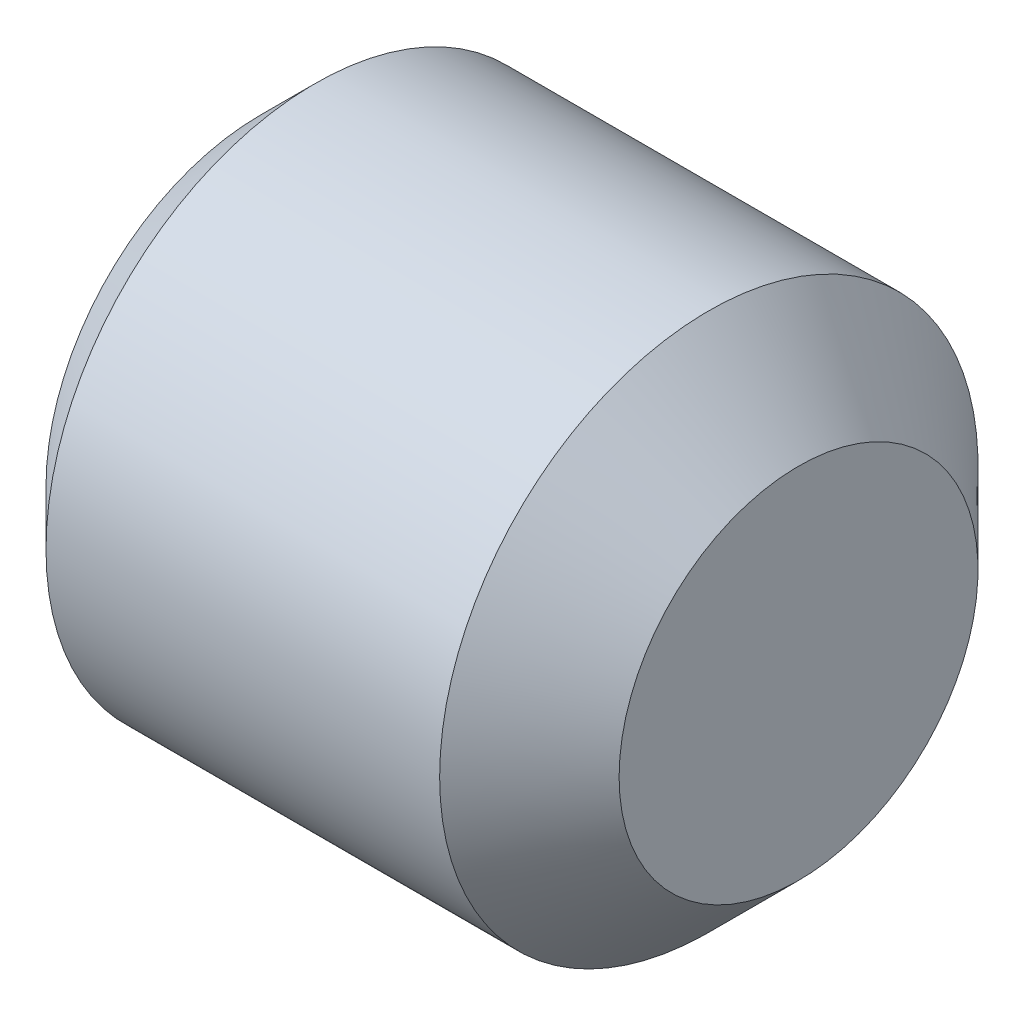
ISO-10303-21;
HEADER;
FILE_DESCRIPTION(('STEP AP214'),'2;1');
FILE_NAME('part.step','',(''),(''),'','','');
FILE_SCHEMA(('AUTOMOTIVE_DESIGN { 1 0 10303 214 1 1 1 1 }'));
ENDSEC;
DATA;
#1=APPLICATION_CONTEXT('core data for automotive mechanical design processes');
#2=APPLICATION_PROTOCOL_DEFINITION('international standard','automotive_design',2000,#1);
#3=PRODUCT_CONTEXT('',#1,'mechanical');
#4=PRODUCT('Part','Part','',(#3));
#5=PRODUCT_RELATED_PRODUCT_CATEGORY('part','',(#4));
#6=PRODUCT_DEFINITION_FORMATION('','',#4);
#7=PRODUCT_DEFINITION_CONTEXT('part definition',#1,'design');
#8=PRODUCT_DEFINITION('design','',#6,#7);
#9=PRODUCT_DEFINITION_SHAPE('','',#8);
#10=(LENGTH_UNIT() NAMED_UNIT(*) SI_UNIT(.MILLI.,.METRE.));
#11=(NAMED_UNIT(*) PLANE_ANGLE_UNIT() SI_UNIT($,.RADIAN.));
#12=(NAMED_UNIT(*) SI_UNIT($,.STERADIAN.) SOLID_ANGLE_UNIT());
#13=UNCERTAINTY_MEASURE_WITH_UNIT(LENGTH_MEASURE(1.E-05),#10,'distance_accuracy_value','');
#14=(GEOMETRIC_REPRESENTATION_CONTEXT(3) GLOBAL_UNCERTAINTY_ASSIGNED_CONTEXT((#13)) GLOBAL_UNIT_ASSIGNED_CONTEXT((#10,
#11,#12)) REPRESENTATION_CONTEXT('',''));
#15=CARTESIAN_POINT('',(0.,0.,0.));
#16=DIRECTION('',(0.,0.,1.));
#17=DIRECTION('',(1.,0.,0.));
#18=AXIS2_PLACEMENT_3D('',#15,#16,#17);
#19=CARTESIAN_POINT('',(-1.8,0.,0.));
#20=DIRECTION('',(-1.,0.,0.));
#21=DIRECTION('',(0.,0.,1.));
#22=AXIS2_PLACEMENT_3D('',#19,#20,#21);
#23=PLANE('',#22);
#24=CARTESIAN_POINT('',(-1.8,0.,0.));
#25=DIRECTION('',(-1.,0.,0.));
#26=DIRECTION('',(0.,0.,1.));
#27=AXIS2_PLACEMENT_3D('',#24,#25,#26);
#28=CIRCLE('',#27,0.75);
#29=CARTESIAN_POINT('',(-1.8,0.375,0.649519052838329));
#30=VERTEX_POINT('',#29);
#31=CARTESIAN_POINT('',(-1.8,0.75,0.));
#32=VERTEX_POINT('',#31);
#33=EDGE_CURVE('E45',#30,#32,#28,.T.);
#34=ORIENTED_EDGE('',*,*,#33,.F.);
#35=DIRECTION('',(0.,0.866025403784438,-0.500000000000001));
#36=VECTOR('',#35,1.);
#37=CARTESIAN_POINT('',(-1.8,0.,0.86602540378444));
#38=LINE('',#37,#36);
#39=CARTESIAN_POINT('',(-1.8,0.75,0.43301270189222));
#40=VERTEX_POINT('',#39);
#41=EDGE_CURVE('E224',#30,#40,#38,.T.);
#42=ORIENTED_EDGE('',*,*,#41,.T.);
#43=DIRECTION('',(0.,0.,-1.));
#44=VECTOR('',#43,1.);
#45=CARTESIAN_POINT('',(-1.8,0.75,0.43301270189222));
#46=LINE('',#45,#44);
#47=EDGE_CURVE('E217',#40,#32,#46,.T.);
#48=ORIENTED_EDGE('',*,*,#47,.T.);
#49=EDGE_LOOP('',(#34,#42,#48));
#50=FACE_BOUND('',#49,.T.);
#51=ADVANCED_FACE('F34',(#50),#23,.T.);
#52=CARTESIAN_POINT('',(-1.8,0.375,-0.649519052838329));
#53=VERTEX_POINT('',#52);
#54=EDGE_CURVE('E11',#32,#53,#28,.T.);
#55=ORIENTED_EDGE('',*,*,#54,.F.);
#56=CARTESIAN_POINT('',(-1.8,0.75,-0.43301270189222));
#57=VERTEX_POINT('',#56);
#58=EDGE_CURVE('E220',#32,#57,#46,.T.);
#59=ORIENTED_EDGE('',*,*,#58,.T.);
#60=DIRECTION('',(0.,-0.866025403784438,-0.500000000000001));
#61=VECTOR('',#60,1.);
#62=CARTESIAN_POINT('',(-1.8,0.75,-0.43301270189222));
#63=LINE('',#62,#61);
#64=EDGE_CURVE('E188',#57,#53,#63,.T.);
#65=ORIENTED_EDGE('',*,*,#64,.T.);
#66=EDGE_LOOP('',(#55,#59,#65));
#67=FACE_BOUND('',#66,.T.);
#68=ADVANCED_FACE('F121',(#67),#23,.T.);
#69=CARTESIAN_POINT('',(-1.8,-0.375,-0.649519052838329));
#70=VERTEX_POINT('',#69);
#71=EDGE_CURVE('E43',#53,#70,#28,.T.);
#72=ORIENTED_EDGE('',*,*,#71,.F.);
#73=CARTESIAN_POINT('',(-1.8,0.,-0.86602540378444));
#74=VERTEX_POINT('',#73);
#75=EDGE_CURVE('E216',#53,#74,#63,.T.);
#76=ORIENTED_EDGE('',*,*,#75,.T.);
#77=DIRECTION('',(0.,-0.866025403784438,0.500000000000001));
#78=VECTOR('',#77,1.);
#79=CARTESIAN_POINT('',(-1.8,0.,-0.86602540378444));
#80=LINE('',#79,#78);
#81=EDGE_CURVE('E233',#74,#70,#80,.T.);
#82=ORIENTED_EDGE('',*,*,#81,.T.);
#83=EDGE_LOOP('',(#72,#76,#82));
#84=FACE_BOUND('',#83,.T.);
#85=ADVANCED_FACE('F126',(#84),#23,.T.);
#86=CARTESIAN_POINT('',(-1.8,-0.75,0.));
#87=VERTEX_POINT('',#86);
#88=EDGE_CURVE('E236',#70,#87,#28,.T.);
#89=ORIENTED_EDGE('',*,*,#88,.F.);
#90=CARTESIAN_POINT('',(-1.8,-0.75,-0.43301270189222));
#91=VERTEX_POINT('',#90);
#92=EDGE_CURVE('E200',#70,#91,#80,.T.);
#93=ORIENTED_EDGE('',*,*,#92,.T.);
#94=DIRECTION('',(0.,0.,1.));
#95=VECTOR('',#94,1.);
#96=CARTESIAN_POINT('',(-1.8,-0.75,-0.43301270189222));
#97=LINE('',#96,#95);
#98=EDGE_CURVE('E229',#91,#87,#97,.T.);
#99=ORIENTED_EDGE('',*,*,#98,.T.);
#100=EDGE_LOOP('',(#89,#93,#99));
#101=FACE_BOUND('',#100,.T.);
#102=ADVANCED_FACE('F243',(#101),#23,.T.);
#103=CARTESIAN_POINT('',(-1.8,-0.375000000000001,0.64951905283833));
#104=VERTEX_POINT('',#103);
#105=EDGE_CURVE('E52',#87,#104,#28,.T.);
#106=ORIENTED_EDGE('',*,*,#105,.F.);
#107=CARTESIAN_POINT('',(-1.8,-0.75,0.43301270189222));
#108=VERTEX_POINT('',#107);
#109=EDGE_CURVE('E232',#87,#108,#97,.T.);
#110=ORIENTED_EDGE('',*,*,#109,.T.);
#111=DIRECTION('',(0.,0.866025403784438,0.500000000000001));
#112=VECTOR('',#111,1.);
#113=CARTESIAN_POINT('',(-1.8,-0.75,0.43301270189222));
#114=LINE('',#113,#112);
#115=EDGE_CURVE('E225',#108,#104,#114,.T.);
#116=ORIENTED_EDGE('',*,*,#115,.T.);
#117=EDGE_LOOP('',(#106,#110,#116));
#118=FACE_BOUND('',#117,.T.);
#119=ADVANCED_FACE('F119',(#118),#23,.T.);
#120=CARTESIAN_POINT('',(-3.,0.,0.));
#121=DIRECTION('',(1.,0.,0.));
#122=DIRECTION('',(0.,0.,-1.));
#123=AXIS2_PLACEMENT_3D('',#120,#121,#122);
#124=PLANE('',#123);
#125=DIRECTION('',(0.,0.,1.));
#126=VECTOR('',#125,1.);
#127=CARTESIAN_POINT('',(-3.,-0.75,-0.43301270189222));
#128=LINE('',#127,#126);
#129=CARTESIAN_POINT('',(-3.,-0.75,-0.43301270189222));
#130=VERTEX_POINT('',#129);
#131=CARTESIAN_POINT('',(-3.,-0.75,0.43301270189222));
#132=VERTEX_POINT('',#131);
#133=EDGE_CURVE('E210',#130,#132,#128,.T.);
#134=ORIENTED_EDGE('',*,*,#133,.F.);
#135=DIRECTION('',(0.,-0.866025403784438,0.500000000000001));
#136=VECTOR('',#135,1.);
#137=CARTESIAN_POINT('',(-3.,0.,-0.86602540378444));
#138=LINE('',#137,#136);
#139=CARTESIAN_POINT('',(-3.,0.,-0.86602540378444));
#140=VERTEX_POINT('',#139);
#141=EDGE_CURVE('E60',#140,#130,#138,.T.);
#142=ORIENTED_EDGE('',*,*,#141,.F.);
#143=DIRECTION('',(0.,-0.866025403784438,-0.500000000000001));
#144=VECTOR('',#143,1.);
#145=CARTESIAN_POINT('',(-3.,0.75,-0.43301270189222));
#146=LINE('',#145,#144);
#147=CARTESIAN_POINT('',(-3.,0.75,-0.43301270189222));
#148=VERTEX_POINT('',#147);
#149=EDGE_CURVE('E197',#148,#140,#146,.T.);
#150=ORIENTED_EDGE('',*,*,#149,.F.);
#151=DIRECTION('',(0.,0.,-1.));
#152=VECTOR('',#151,1.);
#153=CARTESIAN_POINT('',(-3.,0.75,0.43301270189222));
#154=LINE('',#153,#152);
#155=CARTESIAN_POINT('',(-3.,0.75,0.43301270189222));
#156=VERTEX_POINT('',#155);
#157=EDGE_CURVE('E201',#156,#148,#154,.T.);
#158=ORIENTED_EDGE('',*,*,#157,.F.);
#159=DIRECTION('',(0.,0.866025403784438,-0.500000000000001));
#160=VECTOR('',#159,1.);
#161=CARTESIAN_POINT('',(-3.,0.,0.86602540378444));
#162=LINE('',#161,#160);
#163=CARTESIAN_POINT('',(-3.,0.,0.86602540378444));
#164=VERTEX_POINT('',#163);
#165=EDGE_CURVE('E204',#164,#156,#162,.T.);
#166=ORIENTED_EDGE('',*,*,#165,.F.);
#167=DIRECTION('',(0.,0.866025403784438,0.500000000000001));
#168=VECTOR('',#167,1.);
#169=CARTESIAN_POINT('',(-3.,-0.75,0.43301270189222));
#170=LINE('',#169,#168);
#171=EDGE_CURVE('E207',#132,#164,#170,.T.);
#172=ORIENTED_EDGE('',*,*,#171,.F.);
#173=EDGE_LOOP('',(#134,#142,#150,#158,#166,#172));
#174=FACE_BOUND('',#173,.T.);
#175=CARTESIAN_POINT('',(-3.,0.,0.));
#176=DIRECTION('',(-1.,0.,0.));
#177=DIRECTION('',(0.,0.,1.));
#178=AXIS2_PLACEMENT_3D('',#175,#176,#177);
#179=CIRCLE('',#178,1.1935);
#180=CARTESIAN_POINT('',(-3.,0.,1.1935));
#181=VERTEX_POINT('',#180);
#182=EDGE_CURVE('E38',#181,#181,#179,.T.);
#183=ORIENTED_EDGE('',*,*,#182,.T.);
#184=EDGE_LOOP('',(#183));
#185=FACE_BOUND('',#184,.T.);
#186=ADVANCED_FACE('F36',(#174,#185),#124,.F.);
#187=CARTESIAN_POINT('',(-2.6935,0.,0.));
#188=DIRECTION('',(1.,0.,0.));
#189=DIRECTION('',(0.,0.,-1.));
#190=AXIS2_PLACEMENT_3D('',#187,#188,#189);
#191=CONICAL_SURFACE('',#190,1.5,0.785398163397449);
#192=ORIENTED_EDGE('',*,*,#182,.F.);
#193=EDGE_LOOP('',(#192));
#194=FACE_BOUND('',#193,.T.);
#195=CARTESIAN_POINT('',(-2.6935,0.,0.));
#196=DIRECTION('',(-1.,0.,0.));
#197=DIRECTION('',(0.,0.,1.));
#198=AXIS2_PLACEMENT_3D('',#195,#196,#197);
#199=CIRCLE('',#198,1.5);
#200=CARTESIAN_POINT('',(-2.6935,0.,1.5));
#201=VERTEX_POINT('',#200);
#202=EDGE_CURVE('E175',#201,#201,#199,.T.);
#203=ORIENTED_EDGE('',*,*,#202,.T.);
#204=EDGE_LOOP('',(#203));
#205=FACE_BOUND('',#204,.T.);
#206=ADVANCED_FACE('F162',(#194,#205),#191,.T.);
#207=CARTESIAN_POINT('',(0.,0.,0.));
#208=DIRECTION('',(-1.,0.,0.));
#209=DIRECTION('',(0.,0.,1.));
#210=AXIS2_PLACEMENT_3D('',#207,#208,#209);
#211=CYLINDRICAL_SURFACE('',#210,1.5);
#212=ORIENTED_EDGE('',*,*,#202,.F.);
#213=EDGE_LOOP('',(#212));
#214=FACE_BOUND('',#213,.T.);
#215=CARTESIAN_POINT('',(-0.5,0.,0.));
#216=DIRECTION('',(-1.,0.,0.));
#217=DIRECTION('',(0.,0.,1.));
#218=AXIS2_PLACEMENT_3D('',#215,#216,#217);
#219=CIRCLE('',#218,1.5);
#220=CARTESIAN_POINT('',(-0.5,0.,1.5));
#221=VERTEX_POINT('',#220);
#222=EDGE_CURVE('E176',#221,#221,#219,.T.);
#223=ORIENTED_EDGE('',*,*,#222,.T.);
#224=EDGE_LOOP('',(#223));
#225=FACE_BOUND('',#224,.T.);
#226=ADVANCED_FACE('F159',(#214,#225),#211,.T.);
#227=CARTESIAN_POINT('',(0.,0.,0.));
#228=DIRECTION('',(-1.,0.,0.));
#229=DIRECTION('',(0.,0.,1.));
#230=AXIS2_PLACEMENT_3D('',#227,#228,#229);
#231=CONICAL_SURFACE('',#230,1.,0.785398163397448);
#232=ORIENTED_EDGE('',*,*,#222,.F.);
#233=EDGE_LOOP('',(#232));
#234=FACE_BOUND('',#233,.T.);
#235=CARTESIAN_POINT('',(0.,0.,0.));
#236=DIRECTION('',(-1.,0.,0.));
#237=DIRECTION('',(0.,0.,1.));
#238=AXIS2_PLACEMENT_3D('',#235,#236,#237);
#239=CIRCLE('',#238,1.);
#240=CARTESIAN_POINT('',(0.,0.,1.));
#241=VERTEX_POINT('',#240);
#242=EDGE_CURVE('E179',#241,#241,#239,.T.);
#243=ORIENTED_EDGE('',*,*,#242,.T.);
#244=EDGE_LOOP('',(#243));
#245=FACE_BOUND('',#244,.T.);
#246=ADVANCED_FACE('F155',(#234,#245),#231,.T.);
#247=CARTESIAN_POINT('',(0.,1.,0.));
#248=DIRECTION('',(-1.,0.,0.));
#249=DIRECTION('',(0.,0.,1.));
#250=AXIS2_PLACEMENT_3D('',#247,#248,#249);
#251=PLANE('',#250);
#252=ORIENTED_EDGE('',*,*,#242,.F.);
#253=EDGE_LOOP('',(#252));
#254=FACE_BOUND('',#253,.T.);
#255=ADVANCED_FACE('F152',(#254),#251,.F.);
#256=CARTESIAN_POINT('',(-1.8,0.,-0.86602540378444));
#257=DIRECTION('',(0.,-0.500000000000001,-0.866025403784438));
#258=DIRECTION('',(0.,0.866025403784438,-0.500000000000001));
#259=AXIS2_PLACEMENT_3D('',#256,#257,#258);
#260=PLANE('',#259);
#261=ORIENTED_EDGE('',*,*,#141,.T.);
#262=DIRECTION('',(-1.,0.,0.));
#263=VECTOR('',#262,1.);
#264=CARTESIAN_POINT('',(-1.8,-0.75,-0.43301270189222));
#265=LINE('',#264,#263);
#266=EDGE_CURVE('E185',#91,#130,#265,.T.);
#267=ORIENTED_EDGE('',*,*,#266,.F.);
#268=ORIENTED_EDGE('',*,*,#92,.F.);
#269=ORIENTED_EDGE('',*,*,#81,.F.);
#270=DIRECTION('',(-1.,0.,0.));
#271=VECTOR('',#270,1.);
#272=CARTESIAN_POINT('',(-1.8,0.,-0.86602540378444));
#273=LINE('',#272,#271);
#274=EDGE_CURVE('E184',#74,#140,#273,.T.);
#275=ORIENTED_EDGE('',*,*,#274,.T.);
#276=EDGE_LOOP('',(#261,#267,#268,#269,#275));
#277=FACE_BOUND('',#276,.T.);
#278=ADVANCED_FACE('F134',(#277),#260,.F.);
#279=CARTESIAN_POINT('',(-1.8,0.75,-0.43301270189222));
#280=DIRECTION('',(0.,0.500000000000001,-0.866025403784438));
#281=DIRECTION('',(0.,0.866025403784438,0.500000000000001));
#282=AXIS2_PLACEMENT_3D('',#279,#280,#281);
#283=PLANE('',#282);
#284=ORIENTED_EDGE('',*,*,#149,.T.);
#285=ORIENTED_EDGE('',*,*,#274,.F.);
#286=ORIENTED_EDGE('',*,*,#75,.F.);
#287=ORIENTED_EDGE('',*,*,#64,.F.);
#288=DIRECTION('',(-1.,0.,0.));
#289=VECTOR('',#288,1.);
#290=CARTESIAN_POINT('',(-1.8,0.75,-0.43301270189222));
#291=LINE('',#290,#289);
#292=EDGE_CURVE('E194',#57,#148,#291,.T.);
#293=ORIENTED_EDGE('',*,*,#292,.T.);
#294=EDGE_LOOP('',(#284,#285,#286,#287,#293));
#295=FACE_BOUND('',#294,.T.);
#296=ADVANCED_FACE('F130',(#295),#283,.F.);
#297=CARTESIAN_POINT('',(-1.8,0.75,0.43301270189222));
#298=DIRECTION('',(0.,1.,0.));
#299=DIRECTION('',(0.,0.,1.));
#300=AXIS2_PLACEMENT_3D('',#297,#298,#299);
#301=PLANE('',#300);
#302=ORIENTED_EDGE('',*,*,#157,.T.);
#303=ORIENTED_EDGE('',*,*,#292,.F.);
#304=ORIENTED_EDGE('',*,*,#58,.F.);
#305=ORIENTED_EDGE('',*,*,#47,.F.);
#306=DIRECTION('',(-1.,0.,0.));
#307=VECTOR('',#306,1.);
#308=CARTESIAN_POINT('',(-1.8,0.75,0.43301270189222));
#309=LINE('',#308,#307);
#310=EDGE_CURVE('E192',#40,#156,#309,.T.);
#311=ORIENTED_EDGE('',*,*,#310,.T.);
#312=EDGE_LOOP('',(#302,#303,#304,#305,#311));
#313=FACE_BOUND('',#312,.T.);
#314=ADVANCED_FACE('F133',(#313),#301,.F.);
#315=CARTESIAN_POINT('',(-1.8,0.,0.86602540378444));
#316=DIRECTION('',(0.,0.500000000000001,0.866025403784438));
#317=DIRECTION('',(0.,-0.866025403784438,0.500000000000001));
#318=AXIS2_PLACEMENT_3D('',#315,#316,#317);
#319=PLANE('',#318);
#320=ORIENTED_EDGE('',*,*,#165,.T.);
#321=ORIENTED_EDGE('',*,*,#310,.F.);
#322=ORIENTED_EDGE('',*,*,#41,.F.);
#323=CARTESIAN_POINT('',(-1.8,0.,0.86602540378444));
#324=VERTEX_POINT('',#323);
#325=EDGE_CURVE('E221',#324,#30,#38,.T.);
#326=ORIENTED_EDGE('',*,*,#325,.F.);
#327=DIRECTION('',(-1.,0.,0.));
#328=VECTOR('',#327,1.);
#329=CARTESIAN_POINT('',(-1.8,0.,0.86602540378444));
#330=LINE('',#329,#328);
#331=EDGE_CURVE('E190',#324,#164,#330,.T.);
#332=ORIENTED_EDGE('',*,*,#331,.T.);
#333=EDGE_LOOP('',(#320,#321,#322,#326,#332));
#334=FACE_BOUND('',#333,.T.);
#335=ADVANCED_FACE('F138',(#334),#319,.F.);
#336=CARTESIAN_POINT('',(-1.8,-0.75,0.43301270189222));
#337=DIRECTION('',(0.,-0.500000000000001,0.866025403784438));
#338=DIRECTION('',(0.,-0.866025403784438,-0.500000000000001));
#339=AXIS2_PLACEMENT_3D('',#336,#337,#338);
#340=PLANE('',#339);
#341=ORIENTED_EDGE('',*,*,#171,.T.);
#342=ORIENTED_EDGE('',*,*,#331,.F.);
#343=EDGE_CURVE('E228',#104,#324,#114,.T.);
#344=ORIENTED_EDGE('',*,*,#343,.F.);
#345=ORIENTED_EDGE('',*,*,#115,.F.);
#346=DIRECTION('',(-1.,0.,0.));
#347=VECTOR('',#346,1.);
#348=CARTESIAN_POINT('',(-1.8,-0.75,0.43301270189222));
#349=LINE('',#348,#347);
#350=EDGE_CURVE('E187',#108,#132,#349,.T.);
#351=ORIENTED_EDGE('',*,*,#350,.T.);
#352=EDGE_LOOP('',(#341,#342,#344,#345,#351));
#353=FACE_BOUND('',#352,.T.);
#354=ADVANCED_FACE('F142',(#353),#340,.F.);
#355=CARTESIAN_POINT('',(-1.8,-0.75,-0.43301270189222));
#356=DIRECTION('',(0.,-1.,0.));
#357=DIRECTION('',(0.,0.,-1.));
#358=AXIS2_PLACEMENT_3D('',#355,#356,#357);
#359=PLANE('',#358);
#360=ORIENTED_EDGE('',*,*,#133,.T.);
#361=ORIENTED_EDGE('',*,*,#350,.F.);
#362=ORIENTED_EDGE('',*,*,#109,.F.);
#363=ORIENTED_EDGE('',*,*,#98,.F.);
#364=ORIENTED_EDGE('',*,*,#266,.T.);
#365=EDGE_LOOP('',(#360,#361,#362,#363,#364));
#366=FACE_BOUND('',#365,.T.);
#367=ADVANCED_FACE('F116',(#366),#359,.F.);
#368=EDGE_CURVE('E177',#104,#30,#28,.T.);
#369=ORIENTED_EDGE('',*,*,#368,.F.);
#370=ORIENTED_EDGE('',*,*,#343,.T.);
#371=ORIENTED_EDGE('',*,*,#325,.T.);
#372=EDGE_LOOP('',(#369,#370,#371));
#373=FACE_BOUND('',#372,.T.);
#374=ADVANCED_FACE('F111',(#373),#23,.T.);
#375=CARTESIAN_POINT('',(-1.3669872981078,0.,0.));
#376=DIRECTION('',(-1.,0.,0.));
#377=DIRECTION('',(0.,0.,1.));
#378=AXIS2_PLACEMENT_3D('',#375,#376,#377);
#379=CONICAL_SURFACE('',#378,0.,1.04719755119662);
#380=ORIENTED_EDGE('',*,*,#33,.T.);
#381=ORIENTED_EDGE('',*,*,#54,.T.);
#382=ORIENTED_EDGE('',*,*,#71,.T.);
#383=ORIENTED_EDGE('',*,*,#88,.T.);
#384=ORIENTED_EDGE('',*,*,#105,.T.);
#385=ORIENTED_EDGE('',*,*,#368,.T.);
#386=EDGE_LOOP('',(#380,#381,#382,#383,#384,#385));
#387=FACE_BOUND('',#386,.T.);
#388=CARTESIAN_POINT('',(-1.3669872981078,0.,0.));
#389=VERTEX_POINT('',#388);
#390=VERTEX_LOOP('',#389);
#391=FACE_BOUND('',#390,.T.);
#392=ADVANCED_FACE('F109',(#387,#391),#379,.F.);
#393=CLOSED_SHELL('',(#51,#68,#85,#102,#119,#186,#206,#226,#246,#255,#278,#296,#314,#335,#354,
#367,#374,#392));
#394=MANIFOLD_SOLID_BREP('B2',#393);
#395=ADVANCED_BREP_SHAPE_REPRESENTATION('',(#18,#394),#14);
#396=SHAPE_DEFINITION_REPRESENTATION(#9,#395);
ENDSEC;
END-ISO-10303-21;
